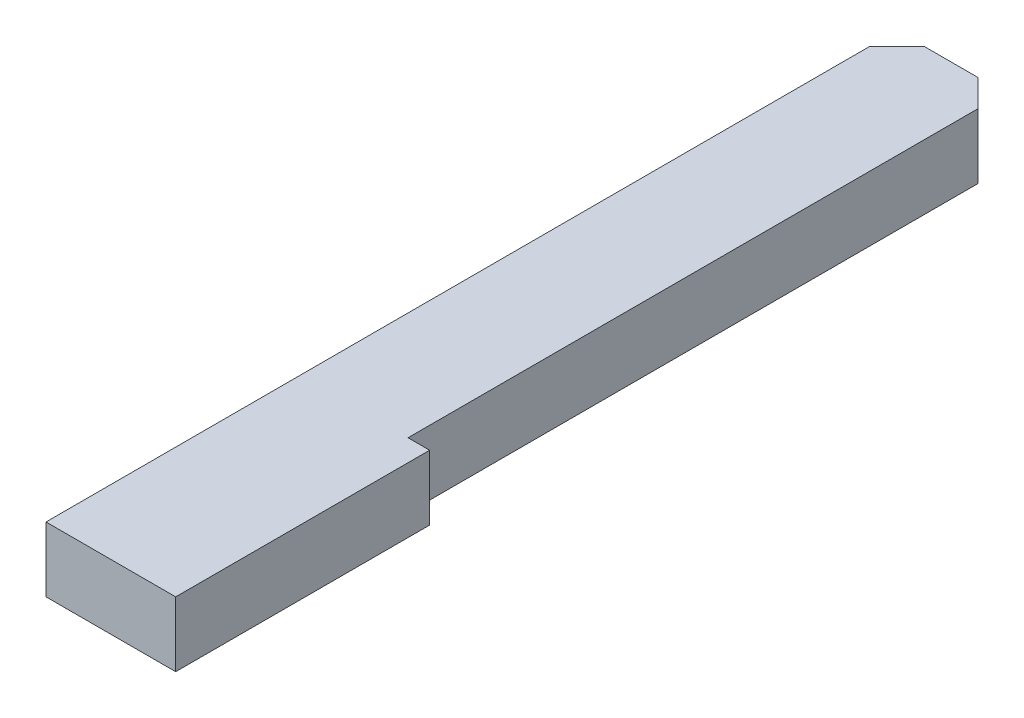
ISO-10303-21;
HEADER;
FILE_DESCRIPTION(('STEP AP214'),'2;1');
FILE_NAME('part.step','',(''),(''),'','','');
FILE_SCHEMA(('AUTOMOTIVE_DESIGN { 1 0 10303 214 1 1 1 1 }'));
ENDSEC;
DATA;
#1=APPLICATION_CONTEXT('core data for automotive mechanical design processes');
#2=APPLICATION_PROTOCOL_DEFINITION('international standard','automotive_design',2000,#1);
#3=PRODUCT_CONTEXT('',#1,'mechanical');
#4=PRODUCT('Part','Part','',(#3));
#5=PRODUCT_RELATED_PRODUCT_CATEGORY('part','',(#4));
#6=PRODUCT_DEFINITION_FORMATION('','',#4);
#7=PRODUCT_DEFINITION_CONTEXT('part definition',#1,'design');
#8=PRODUCT_DEFINITION('design','',#6,#7);
#9=PRODUCT_DEFINITION_SHAPE('','',#8);
#10=(LENGTH_UNIT() NAMED_UNIT(*) SI_UNIT(.MILLI.,.METRE.));
#11=(NAMED_UNIT(*) PLANE_ANGLE_UNIT() SI_UNIT($,.RADIAN.));
#12=(NAMED_UNIT(*) SI_UNIT($,.STERADIAN.) SOLID_ANGLE_UNIT());
#13=UNCERTAINTY_MEASURE_WITH_UNIT(LENGTH_MEASURE(1.E-05),#10,'distance_accuracy_value','');
#14=(GEOMETRIC_REPRESENTATION_CONTEXT(3) GLOBAL_UNCERTAINTY_ASSIGNED_CONTEXT((#13)) GLOBAL_UNIT_ASSIGNED_CONTEXT((#10,
#11,#12)) REPRESENTATION_CONTEXT('',''));
#15=CARTESIAN_POINT('',(0.,0.,0.));
#16=DIRECTION('',(0.,0.,1.));
#17=DIRECTION('',(1.,0.,0.));
#18=AXIS2_PLACEMENT_3D('',#15,#16,#17);
#19=CARTESIAN_POINT('',(2.7559,-0.1524,-4.8006));
#20=DIRECTION('',(1.,0.,0.));
#21=DIRECTION('',(0.,0.,-1.));
#22=AXIS2_PLACEMENT_3D('',#19,#20,#21);
#23=PLANE('',#22);
#24=DIRECTION('',(0.,-1.,0.));
#25=VECTOR('',#24,1.);
#26=CARTESIAN_POINT('',(2.7559,0.,-7.4798));
#27=LINE('',#26,#25);
#28=CARTESIAN_POINT('',(2.7559,0.1524,-7.4798));
#29=VERTEX_POINT('',#28);
#30=CARTESIAN_POINT('',(2.7559,-0.1524,-7.4798));
#31=VERTEX_POINT('',#30);
#32=EDGE_CURVE('E11',#29,#31,#27,.T.);
#33=ORIENTED_EDGE('',*,*,#32,.F.);
#34=DIRECTION('',(0.,0.,-1.));
#35=VECTOR('',#34,1.);
#36=CARTESIAN_POINT('',(2.7559,0.1524,-4.8006));
#37=LINE('',#36,#35);
#38=CARTESIAN_POINT('',(2.7559,0.1524,-4.8006));
#39=VERTEX_POINT('',#38);
#40=EDGE_CURVE('E24',#39,#29,#37,.T.);
#41=ORIENTED_EDGE('',*,*,#40,.F.);
#42=DIRECTION('',(0.,1.,0.));
#43=VECTOR('',#42,1.);
#44=CARTESIAN_POINT('',(2.7559,-0.1524,-4.8006));
#45=LINE('',#44,#43);
#46=CARTESIAN_POINT('',(2.7559,-0.1524,-4.8006));
#47=VERTEX_POINT('',#46);
#48=EDGE_CURVE('E143',#47,#39,#45,.T.);
#49=ORIENTED_EDGE('',*,*,#48,.F.);
#50=DIRECTION('',(0.,0.,-1.));
#51=VECTOR('',#50,1.);
#52=CARTESIAN_POINT('',(2.7559,-0.1524,-4.8006));
#53=LINE('',#52,#51);
#54=EDGE_CURVE('E141',#47,#31,#53,.T.);
#55=ORIENTED_EDGE('',*,*,#54,.T.);
#56=EDGE_LOOP('',(#33,#41,#49,#55));
#57=FACE_BOUND('',#56,.T.);
#58=ADVANCED_FACE('F17',(#57),#23,.T.);
#59=CARTESIAN_POINT('',(2.8575,-0.1524,-4.8006));
#60=DIRECTION('',(0.,0.,-1.));
#61=DIRECTION('',(-1.,0.,0.));
#62=AXIS2_PLACEMENT_3D('',#59,#60,#61);
#63=PLANE('',#62);
#64=DIRECTION('',(-1.,0.,0.));
#65=VECTOR('',#64,1.);
#66=CARTESIAN_POINT('',(2.8575,-0.1524,-4.8006));
#67=LINE('',#66,#65);
#68=CARTESIAN_POINT('',(2.8575,-0.1524,-4.8006));
#69=VERTEX_POINT('',#68);
#70=EDGE_CURVE('E138',#69,#47,#67,.T.);
#71=ORIENTED_EDGE('',*,*,#70,.T.);
#72=ORIENTED_EDGE('',*,*,#48,.T.);
#73=DIRECTION('',(-1.,0.,0.));
#74=VECTOR('',#73,1.);
#75=CARTESIAN_POINT('',(2.8575,0.1524,-4.8006));
#76=LINE('',#75,#74);
#77=CARTESIAN_POINT('',(2.8575,0.1524,-4.8006));
#78=VERTEX_POINT('',#77);
#79=EDGE_CURVE('E135',#78,#39,#76,.T.);
#80=ORIENTED_EDGE('',*,*,#79,.F.);
#81=DIRECTION('',(0.,1.,0.));
#82=VECTOR('',#81,1.);
#83=CARTESIAN_POINT('',(2.8575,-0.1524,-4.8006));
#84=LINE('',#83,#82);
#85=EDGE_CURVE('E132',#69,#78,#84,.T.);
#86=ORIENTED_EDGE('',*,*,#85,.F.);
#87=EDGE_LOOP('',(#71,#72,#80,#86));
#88=FACE_BOUND('',#87,.T.);
#89=ADVANCED_FACE('F163',(#88),#63,.T.);
#90=CARTESIAN_POINT('',(2.8575,-0.1524,-2.5908));
#91=DIRECTION('',(1.,0.,0.));
#92=DIRECTION('',(0.,0.,-1.));
#93=AXIS2_PLACEMENT_3D('',#90,#91,#92);
#94=PLANE('',#93);
#95=DIRECTION('',(0.,0.,-1.));
#96=VECTOR('',#95,1.);
#97=CARTESIAN_POINT('',(2.8575,-0.1524,-3.6068));
#98=LINE('',#97,#96);
#99=CARTESIAN_POINT('',(2.8575,-0.1524,-3.6068));
#100=VERTEX_POINT('',#99);
#101=EDGE_CURVE('E129',#100,#69,#98,.T.);
#102=ORIENTED_EDGE('',*,*,#101,.T.);
#103=ORIENTED_EDGE('',*,*,#85,.T.);
#104=DIRECTION('',(0.,0.,-1.));
#105=VECTOR('',#104,1.);
#106=CARTESIAN_POINT('',(2.8575,0.1524,-3.6068));
#107=LINE('',#106,#105);
#108=CARTESIAN_POINT('',(2.8575,0.1524,-3.6068));
#109=VERTEX_POINT('',#108);
#110=EDGE_CURVE('E126',#109,#78,#107,.T.);
#111=ORIENTED_EDGE('',*,*,#110,.F.);
#112=DIRECTION('',(0.,1.,0.));
#113=VECTOR('',#112,1.);
#114=CARTESIAN_POINT('',(2.8575,-0.1524,-3.6068));
#115=LINE('',#114,#113);
#116=EDGE_CURVE('E123',#100,#109,#115,.T.);
#117=ORIENTED_EDGE('',*,*,#116,.F.);
#118=EDGE_LOOP('',(#102,#103,#111,#117));
#119=FACE_BOUND('',#118,.T.);
#120=ADVANCED_FACE('F160',(#119),#94,.T.);
#121=CARTESIAN_POINT('',(0.,-0.1524,0.));
#122=DIRECTION('',(0.,1.,0.));
#123=DIRECTION('',(-1.,0.,0.));
#124=AXIS2_PLACEMENT_3D('',#121,#122,#123);
#125=PLANE('',#124);
#126=DIRECTION('',(-0.707106781186548,0.,0.707106781186548));
#127=VECTOR('',#126,1.);
#128=CARTESIAN_POINT('',(-0.152275,-0.1524,-5.079625));
#129=LINE('',#128,#127);
#130=CARTESIAN_POINT('',(2.3749,-0.1524,-7.6068));
#131=VERTEX_POINT('',#130);
#132=CARTESIAN_POINT('',(2.2479,-0.1524,-7.4798));
#133=VERTEX_POINT('',#132);
#134=EDGE_CURVE('E121',#131,#133,#129,.T.);
#135=ORIENTED_EDGE('',*,*,#134,.F.);
#136=DIRECTION('',(1.,0.,0.));
#137=VECTOR('',#136,1.);
#138=CARTESIAN_POINT('',(-1.8726013177242,-0.1524,-7.6068));
#139=LINE('',#138,#137);
#140=CARTESIAN_POINT('',(2.6289,-0.1524,-7.6068));
#141=VERTEX_POINT('',#140);
#142=EDGE_CURVE('E101',#131,#141,#139,.T.);
#143=ORIENTED_EDGE('',*,*,#142,.T.);
#144=DIRECTION('',(-0.707106781186548,0.,-0.707106781186548));
#145=VECTOR('',#144,1.);
#146=CARTESIAN_POINT('',(3.905125,-0.1524,-6.330575));
#147=LINE('',#146,#145);
#148=EDGE_CURVE('E118',#31,#141,#147,.T.);
#149=ORIENTED_EDGE('',*,*,#148,.F.);
#150=ORIENTED_EDGE('',*,*,#54,.F.);
#151=ORIENTED_EDGE('',*,*,#70,.F.);
#152=ORIENTED_EDGE('',*,*,#101,.F.);
#153=DIRECTION('',(-1.,0.,0.));
#154=VECTOR('',#153,1.);
#155=CARTESIAN_POINT('',(2.8575,-0.1524,-3.6068));
#156=LINE('',#155,#154);
#157=CARTESIAN_POINT('',(2.2479,-0.1524,-3.6068));
#158=VERTEX_POINT('',#157);
#159=EDGE_CURVE('E116',#100,#158,#156,.T.);
#160=ORIENTED_EDGE('',*,*,#159,.T.);
#161=DIRECTION('',(0.,0.,1.));
#162=VECTOR('',#161,1.);
#163=CARTESIAN_POINT('',(2.2479,-0.1524,-17.3863));
#164=LINE('',#163,#162);
#165=EDGE_CURVE('E113',#133,#158,#164,.T.);
#166=ORIENTED_EDGE('',*,*,#165,.F.);
#167=EDGE_LOOP('',(#135,#143,#149,#150,#151,#152,#160,#166));
#168=FACE_BOUND('',#167,.T.);
#169=ADVANCED_FACE('F149',(#168),#125,.F.);
#170=CARTESIAN_POINT('',(2.2479,-0.1524,-17.3863));
#171=DIRECTION('',(-1.,0.,0.));
#172=DIRECTION('',(0.,0.,1.));
#173=AXIS2_PLACEMENT_3D('',#170,#171,#172);
#174=PLANE('',#173);
#175=DIRECTION('',(0.,1.,0.));
#176=VECTOR('',#175,1.);
#177=CARTESIAN_POINT('',(2.2479,0.,-7.4798));
#178=LINE('',#177,#176);
#179=CARTESIAN_POINT('',(2.2479,0.1524,-7.4798));
#180=VERTEX_POINT('',#179);
#181=EDGE_CURVE('E84',#133,#180,#178,.T.);
#182=ORIENTED_EDGE('',*,*,#181,.F.);
#183=ORIENTED_EDGE('',*,*,#165,.T.);
#184=DIRECTION('',(0.,1.,0.));
#185=VECTOR('',#184,1.);
#186=CARTESIAN_POINT('',(2.2479,-0.1524,-3.6068));
#187=LINE('',#186,#185);
#188=CARTESIAN_POINT('',(2.2479,0.1524,-3.6068));
#189=VERTEX_POINT('',#188);
#190=EDGE_CURVE('E110',#158,#189,#187,.T.);
#191=ORIENTED_EDGE('',*,*,#190,.T.);
#192=DIRECTION('',(0.,0.,1.));
#193=VECTOR('',#192,1.);
#194=CARTESIAN_POINT('',(2.2479,0.1524,-17.3863));
#195=LINE('',#194,#193);
#196=EDGE_CURVE('E108',#180,#189,#195,.T.);
#197=ORIENTED_EDGE('',*,*,#196,.F.);
#198=EDGE_LOOP('',(#182,#183,#191,#197));
#199=FACE_BOUND('',#198,.T.);
#200=ADVANCED_FACE('F154',(#199),#174,.T.);
#201=CARTESIAN_POINT('',(2.6924,0.,-7.5433));
#202=DIRECTION('',(0.707106781186548,0.,-0.707106781186548));
#203=DIRECTION('',(-0.707106781186548,0.,-0.707106781186548));
#204=AXIS2_PLACEMENT_3D('',#201,#202,#203);
#205=PLANE('',#204);
#206=DIRECTION('',(0.707106781186548,0.,0.707106781186548));
#207=VECTOR('',#206,1.);
#208=CARTESIAN_POINT('',(3.905125,0.1524,-6.330575));
#209=LINE('',#208,#207);
#210=CARTESIAN_POINT('',(2.6289,0.1524,-7.6068));
#211=VERTEX_POINT('',#210);
#212=EDGE_CURVE('E94',#211,#29,#209,.T.);
#213=ORIENTED_EDGE('',*,*,#212,.T.);
#214=ORIENTED_EDGE('',*,*,#32,.T.);
#215=ORIENTED_EDGE('',*,*,#148,.T.);
#216=DIRECTION('',(0.,1.,0.));
#217=VECTOR('',#216,1.);
#218=CARTESIAN_POINT('',(2.6289,0.,-7.6068));
#219=LINE('',#218,#217);
#220=EDGE_CURVE('E88',#141,#211,#219,.T.);
#221=ORIENTED_EDGE('',*,*,#220,.T.);
#222=EDGE_LOOP('',(#213,#214,#215,#221));
#223=FACE_BOUND('',#222,.T.);
#224=ADVANCED_FACE('F145',(#223),#205,.T.);
#225=CARTESIAN_POINT('',(0.,0.1524,0.));
#226=DIRECTION('',(0.,1.,0.));
#227=DIRECTION('',(-1.,0.,0.));
#228=AXIS2_PLACEMENT_3D('',#225,#226,#227);
#229=PLANE('',#228);
#230=DIRECTION('',(0.707106781186548,0.,-0.707106781186548));
#231=VECTOR('',#230,1.);
#232=CARTESIAN_POINT('',(-0.152275,0.1524,-5.079625));
#233=LINE('',#232,#231);
#234=CARTESIAN_POINT('',(2.3749,0.1524,-7.6068));
#235=VERTEX_POINT('',#234);
#236=EDGE_CURVE('E78',#180,#235,#233,.T.);
#237=ORIENTED_EDGE('',*,*,#236,.F.);
#238=ORIENTED_EDGE('',*,*,#196,.T.);
#239=DIRECTION('',(1.,0.,0.));
#240=VECTOR('',#239,1.);
#241=CARTESIAN_POINT('',(2.2479,0.1524,-3.6068));
#242=LINE('',#241,#240);
#243=EDGE_CURVE('E89',#189,#109,#242,.T.);
#244=ORIENTED_EDGE('',*,*,#243,.T.);
#245=ORIENTED_EDGE('',*,*,#110,.T.);
#246=ORIENTED_EDGE('',*,*,#79,.T.);
#247=ORIENTED_EDGE('',*,*,#40,.T.);
#248=ORIENTED_EDGE('',*,*,#212,.F.);
#249=DIRECTION('',(-1.,0.,0.));
#250=VECTOR('',#249,1.);
#251=CARTESIAN_POINT('',(-1.8726013177242,0.1524,-7.6068));
#252=LINE('',#251,#250);
#253=EDGE_CURVE('E92',#211,#235,#252,.T.);
#254=ORIENTED_EDGE('',*,*,#253,.T.);
#255=EDGE_LOOP('',(#237,#238,#244,#245,#246,#247,#248,#254));
#256=FACE_BOUND('',#255,.T.);
#257=ADVANCED_FACE('F93',(#256),#229,.T.);
#258=CARTESIAN_POINT('',(-3.7452026354484,0.1524,-7.6068));
#259=DIRECTION('',(0.,0.,1.));
#260=DIRECTION('',(1.,0.,0.));
#261=AXIS2_PLACEMENT_3D('',#258,#259,#260);
#262=PLANE('',#261);
#263=DIRECTION('',(0.,-1.,0.));
#264=VECTOR('',#263,1.);
#265=CARTESIAN_POINT('',(2.3749,0.,-7.6068));
#266=LINE('',#265,#264);
#267=EDGE_CURVE('E82',#235,#131,#266,.T.);
#268=ORIENTED_EDGE('',*,*,#267,.F.);
#269=ORIENTED_EDGE('',*,*,#253,.F.);
#270=ORIENTED_EDGE('',*,*,#220,.F.);
#271=ORIENTED_EDGE('',*,*,#142,.F.);
#272=EDGE_LOOP('',(#268,#269,#270,#271));
#273=FACE_BOUND('',#272,.T.);
#274=ADVANCED_FACE('F100',(#273),#262,.F.);
#275=CARTESIAN_POINT('',(2.3114,0.,-7.5433));
#276=DIRECTION('',(-0.707106781186548,0.,-0.707106781186548));
#277=DIRECTION('',(-0.707106781186548,0.,0.707106781186548));
#278=AXIS2_PLACEMENT_3D('',#275,#276,#277);
#279=PLANE('',#278);
#280=ORIENTED_EDGE('',*,*,#134,.T.);
#281=ORIENTED_EDGE('',*,*,#181,.T.);
#282=ORIENTED_EDGE('',*,*,#236,.T.);
#283=ORIENTED_EDGE('',*,*,#267,.T.);
#284=EDGE_LOOP('',(#280,#281,#282,#283));
#285=FACE_BOUND('',#284,.T.);
#286=ADVANCED_FACE('F80',(#285),#279,.T.);
#287=CARTESIAN_POINT('',(-0.0205768429521332,0.442402106867451,-3.6068));
#288=DIRECTION('',(0.,0.,1.));
#289=DIRECTION('',(1.,0.,0.));
#290=AXIS2_PLACEMENT_3D('',#287,#288,#289);
#291=PLANE('',#290);
#292=ORIENTED_EDGE('',*,*,#243,.F.);
#293=ORIENTED_EDGE('',*,*,#190,.F.);
#294=ORIENTED_EDGE('',*,*,#159,.F.);
#295=ORIENTED_EDGE('',*,*,#116,.T.);
#296=EDGE_LOOP('',(#292,#293,#294,#295));
#297=FACE_BOUND('',#296,.T.);
#298=ADVANCED_FACE('F157',(#297),#291,.T.);
#299=CLOSED_SHELL('',(#58,#89,#120,#169,#200,#224,#257,#274,#286,#298));
#300=MANIFOLD_SOLID_BREP('B1',#299);
#301=ADVANCED_BREP_SHAPE_REPRESENTATION('',(#18,#300),#14);
#302=SHAPE_DEFINITION_REPRESENTATION(#9,#301);
ENDSEC;
END-ISO-10303-21;
